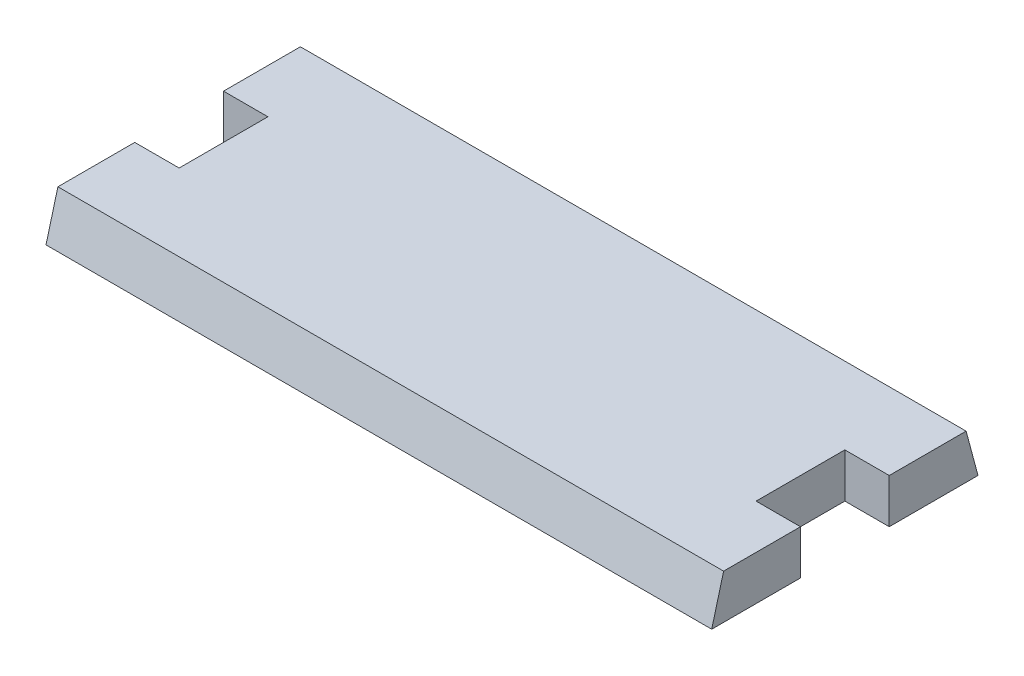
ISO-10303-21;
HEADER;
FILE_DESCRIPTION(('STEP AP214'),'2;1');
FILE_NAME('part.step','',(''),(''),'','','');
FILE_SCHEMA(('AUTOMOTIVE_DESIGN { 1 0 10303 214 1 1 1 1 }'));
ENDSEC;
DATA;
#1=APPLICATION_CONTEXT('core data for automotive mechanical design processes');
#2=APPLICATION_PROTOCOL_DEFINITION('international standard','automotive_design',2000,#1);
#3=PRODUCT_CONTEXT('',#1,'mechanical');
#4=PRODUCT('Part','Part','',(#3));
#5=PRODUCT_RELATED_PRODUCT_CATEGORY('part','',(#4));
#6=PRODUCT_DEFINITION_FORMATION('','',#4);
#7=PRODUCT_DEFINITION_CONTEXT('part definition',#1,'design');
#8=PRODUCT_DEFINITION('design','',#6,#7);
#9=PRODUCT_DEFINITION_SHAPE('','',#8);
#10=(LENGTH_UNIT() NAMED_UNIT(*) SI_UNIT(.MILLI.,.METRE.));
#11=(NAMED_UNIT(*) PLANE_ANGLE_UNIT() SI_UNIT($,.RADIAN.));
#12=(NAMED_UNIT(*) SI_UNIT($,.STERADIAN.) SOLID_ANGLE_UNIT());
#13=UNCERTAINTY_MEASURE_WITH_UNIT(LENGTH_MEASURE(1.E-05),#10,'distance_accuracy_value','');
#14=(GEOMETRIC_REPRESENTATION_CONTEXT(3) GLOBAL_UNCERTAINTY_ASSIGNED_CONTEXT((#13)) GLOBAL_UNIT_ASSIGNED_CONTEXT((#10,
#11,#12)) REPRESENTATION_CONTEXT('',''));
#15=CARTESIAN_POINT('',(0.,0.,0.));
#16=DIRECTION('',(0.,0.,1.));
#17=DIRECTION('',(1.,0.,0.));
#18=AXIS2_PLACEMENT_3D('',#15,#16,#17);
#19=CARTESIAN_POINT('',(0.,0.,-30.));
#20=DIRECTION('',(0.,0.258819045102521,-0.965925826289068));
#21=DIRECTION('',(0.,0.965925826289068,0.258819045102521));
#22=AXIS2_PLACEMENT_3D('',#19,#20,#21);
#23=PLANE('',#22);
#24=DIRECTION('',(1.,0.,0.));
#25=VECTOR('',#24,1.);
#26=CARTESIAN_POINT('',(0.,0.,-30.));
#27=LINE('',#26,#25);
#28=CARTESIAN_POINT('',(-75.,0.,-30.));
#29=VERTEX_POINT('',#28);
#30=CARTESIAN_POINT('',(75.,0.,-30.));
#31=VERTEX_POINT('',#30);
#32=EDGE_CURVE('E133',#29,#31,#27,.T.);
#33=ORIENTED_EDGE('',*,*,#32,.F.);
#34=DIRECTION('',(0.,-0.965925826289068,-0.258819045102521));
#35=VECTOR('',#34,1.);
#36=CARTESIAN_POINT('',(-75.,16.8301270189222,-25.4903810567666));
#37=LINE('',#36,#35);
#38=CARTESIAN_POINT('',(-75.,10.,-27.3205080756888));
#39=VERTEX_POINT('',#38);
#40=EDGE_CURVE('E11',#39,#29,#37,.T.);
#41=ORIENTED_EDGE('',*,*,#40,.F.);
#42=DIRECTION('',(1.,0.,0.));
#43=VECTOR('',#42,1.);
#44=CARTESIAN_POINT('',(0.,10.,-27.3205080756888));
#45=LINE('',#44,#43);
#46=CARTESIAN_POINT('',(75.,10.,-27.3205080756888));
#47=VERTEX_POINT('',#46);
#48=EDGE_CURVE('E135',#39,#47,#45,.T.);
#49=ORIENTED_EDGE('',*,*,#48,.T.);
#50=DIRECTION('',(0.,-0.965925826289068,-0.258819045102521));
#51=VECTOR('',#50,1.);
#52=CARTESIAN_POINT('',(75.,16.8301270189222,-25.4903810567666));
#53=LINE('',#52,#51);
#54=EDGE_CURVE('E131',#47,#31,#53,.T.);
#55=ORIENTED_EDGE('',*,*,#54,.T.);
#56=EDGE_LOOP('',(#33,#41,#49,#55));
#57=FACE_BOUND('',#56,.T.);
#58=ADVANCED_FACE('F32',(#57),#23,.T.);
#59=CARTESIAN_POINT('',(-75.,10.,0.));
#60=DIRECTION('',(-1.,0.,0.));
#61=DIRECTION('',(0.,0.,1.));
#62=AXIS2_PLACEMENT_3D('',#59,#60,#61);
#63=PLANE('',#62);
#64=DIRECTION('',(0.,0.,-1.));
#65=VECTOR('',#64,1.);
#66=CARTESIAN_POINT('',(-75.,0.,0.));
#67=LINE('',#66,#65);
#68=CARTESIAN_POINT('',(-75.,0.,-10.));
#69=VERTEX_POINT('',#68);
#70=EDGE_CURVE('E147',#69,#29,#67,.T.);
#71=ORIENTED_EDGE('',*,*,#70,.F.);
#72=DIRECTION('',(0.,-1.,0.));
#73=VECTOR('',#72,1.);
#74=CARTESIAN_POINT('',(-75.,10.,-10.));
#75=LINE('',#74,#73);
#76=CARTESIAN_POINT('',(-75.,10.,-10.));
#77=VERTEX_POINT('',#76);
#78=EDGE_CURVE('E42',#77,#69,#75,.T.);
#79=ORIENTED_EDGE('',*,*,#78,.F.);
#80=DIRECTION('',(0.,0.,-1.));
#81=VECTOR('',#80,1.);
#82=CARTESIAN_POINT('',(-75.,10.,0.));
#83=LINE('',#82,#81);
#84=EDGE_CURVE('E190',#77,#39,#83,.T.);
#85=ORIENTED_EDGE('',*,*,#84,.T.);
#86=ORIENTED_EDGE('',*,*,#40,.T.);
#87=EDGE_LOOP('',(#71,#79,#85,#86));
#88=FACE_BOUND('',#87,.T.);
#89=ADVANCED_FACE('F248',(#88),#63,.T.);
#90=CARTESIAN_POINT('',(0.,10.,-9.99999999999998));
#91=DIRECTION('',(0.,0.,-1.));
#92=DIRECTION('',(-1.,0.,0.));
#93=AXIS2_PLACEMENT_3D('',#90,#91,#92);
#94=PLANE('',#93);
#95=DIRECTION('',(1.,0.,0.));
#96=VECTOR('',#95,1.);
#97=CARTESIAN_POINT('',(0.,0.,-9.99999999999998));
#98=LINE('',#97,#96);
#99=CARTESIAN_POINT('',(-65.,0.,-10.));
#100=VERTEX_POINT('',#99);
#101=EDGE_CURVE('E149',#69,#100,#98,.T.);
#102=ORIENTED_EDGE('',*,*,#101,.T.);
#103=DIRECTION('',(0.,-1.,0.));
#104=VECTOR('',#103,1.);
#105=CARTESIAN_POINT('',(-65.,10.,-10.));
#106=LINE('',#105,#104);
#107=CARTESIAN_POINT('',(-65.,10.,-10.));
#108=VERTEX_POINT('',#107);
#109=EDGE_CURVE('E186',#108,#100,#106,.T.);
#110=ORIENTED_EDGE('',*,*,#109,.F.);
#111=DIRECTION('',(1.,0.,0.));
#112=VECTOR('',#111,1.);
#113=CARTESIAN_POINT('',(0.,10.,-9.99999999999998));
#114=LINE('',#113,#112);
#115=EDGE_CURVE('E242',#77,#108,#114,.T.);
#116=ORIENTED_EDGE('',*,*,#115,.F.);
#117=ORIENTED_EDGE('',*,*,#78,.T.);
#118=EDGE_LOOP('',(#102,#110,#116,#117));
#119=FACE_BOUND('',#118,.T.);
#120=ADVANCED_FACE('F240',(#119),#94,.F.);
#121=CARTESIAN_POINT('',(-65.,10.,0.));
#122=DIRECTION('',(1.,0.,0.));
#123=DIRECTION('',(0.,0.,-1.));
#124=AXIS2_PLACEMENT_3D('',#121,#122,#123);
#125=PLANE('',#124);
#126=DIRECTION('',(0.,0.,1.));
#127=VECTOR('',#126,1.);
#128=CARTESIAN_POINT('',(-65.,0.,0.));
#129=LINE('',#128,#127);
#130=CARTESIAN_POINT('',(-65.,0.,9.99999999999999));
#131=VERTEX_POINT('',#130);
#132=EDGE_CURVE('E155',#100,#131,#129,.T.);
#133=ORIENTED_EDGE('',*,*,#132,.T.);
#134=DIRECTION('',(0.,-1.,0.));
#135=VECTOR('',#134,1.);
#136=CARTESIAN_POINT('',(-65.,10.,9.99999999999999));
#137=LINE('',#136,#135);
#138=CARTESIAN_POINT('',(-65.,10.,9.99999999999999));
#139=VERTEX_POINT('',#138);
#140=EDGE_CURVE('E184',#139,#131,#137,.T.);
#141=ORIENTED_EDGE('',*,*,#140,.F.);
#142=DIRECTION('',(0.,0.,1.));
#143=VECTOR('',#142,1.);
#144=CARTESIAN_POINT('',(-65.,10.,0.));
#145=LINE('',#144,#143);
#146=EDGE_CURVE('E201',#108,#139,#145,.T.);
#147=ORIENTED_EDGE('',*,*,#146,.F.);
#148=ORIENTED_EDGE('',*,*,#109,.T.);
#149=EDGE_LOOP('',(#133,#141,#147,#148));
#150=FACE_BOUND('',#149,.T.);
#151=ADVANCED_FACE('F235',(#150),#125,.F.);
#152=CARTESIAN_POINT('',(0.,10.,9.99999999999998));
#153=DIRECTION('',(0.,0.,-1.));
#154=DIRECTION('',(-1.,0.,0.));
#155=AXIS2_PLACEMENT_3D('',#152,#153,#154);
#156=PLANE('',#155);
#157=DIRECTION('',(1.,0.,0.));
#158=VECTOR('',#157,1.);
#159=CARTESIAN_POINT('',(0.,0.,9.99999999999998));
#160=LINE('',#159,#158);
#161=CARTESIAN_POINT('',(-75.,0.,9.99999999999999));
#162=VERTEX_POINT('',#161);
#163=EDGE_CURVE('E158',#162,#131,#160,.T.);
#164=ORIENTED_EDGE('',*,*,#163,.F.);
#165=DIRECTION('',(0.,-1.,0.));
#166=VECTOR('',#165,1.);
#167=CARTESIAN_POINT('',(-75.,10.,9.99999999999999));
#168=LINE('',#167,#166);
#169=CARTESIAN_POINT('',(-75.,10.,9.99999999999999));
#170=VERTEX_POINT('',#169);
#171=EDGE_CURVE('E81',#170,#162,#168,.T.);
#172=ORIENTED_EDGE('',*,*,#171,.F.);
#173=DIRECTION('',(1.,0.,0.));
#174=VECTOR('',#173,1.);
#175=CARTESIAN_POINT('',(0.,10.,9.99999999999998));
#176=LINE('',#175,#174);
#177=EDGE_CURVE('E199',#170,#139,#176,.T.);
#178=ORIENTED_EDGE('',*,*,#177,.T.);
#179=ORIENTED_EDGE('',*,*,#140,.T.);
#180=EDGE_LOOP('',(#164,#172,#178,#179));
#181=FACE_BOUND('',#180,.T.);
#182=ADVANCED_FACE('F231',(#181),#156,.T.);
#183=CARTESIAN_POINT('',(-75.,10.,0.));
#184=DIRECTION('',(-1.,0.,0.));
#185=DIRECTION('',(0.,0.,1.));
#186=AXIS2_PLACEMENT_3D('',#183,#184,#185);
#187=PLANE('',#186);
#188=DIRECTION('',(0.,0.,-1.));
#189=VECTOR('',#188,1.);
#190=CARTESIAN_POINT('',(-75.,0.,0.));
#191=LINE('',#190,#189);
#192=CARTESIAN_POINT('',(-75.,0.,30.));
#193=VERTEX_POINT('',#192);
#194=EDGE_CURVE('E161',#193,#162,#191,.T.);
#195=ORIENTED_EDGE('',*,*,#194,.F.);
#196=DIRECTION('',(0.,0.965925826289068,-0.258819045102521));
#197=VECTOR('',#196,1.);
#198=CARTESIAN_POINT('',(-75.,16.8301270189222,25.4903810567666));
#199=LINE('',#198,#197);
#200=CARTESIAN_POINT('',(-75.,10.,27.3205080756888));
#201=VERTEX_POINT('',#200);
#202=EDGE_CURVE('E70',#201,#193,#199,.F.);
#203=ORIENTED_EDGE('',*,*,#202,.F.);
#204=DIRECTION('',(0.,0.,-1.));
#205=VECTOR('',#204,1.);
#206=CARTESIAN_POINT('',(-75.,10.,0.));
#207=LINE('',#206,#205);
#208=EDGE_CURVE('E194',#201,#170,#207,.T.);
#209=ORIENTED_EDGE('',*,*,#208,.T.);
#210=ORIENTED_EDGE('',*,*,#171,.T.);
#211=EDGE_LOOP('',(#195,#203,#209,#210));
#212=FACE_BOUND('',#211,.T.);
#213=ADVANCED_FACE('F230',(#212),#187,.T.);
#214=CARTESIAN_POINT('',(0.,0.,30.));
#215=DIRECTION('',(0.,0.258819045102521,0.965925826289068));
#216=DIRECTION('',(0.,-0.965925826289068,0.258819045102521));
#217=AXIS2_PLACEMENT_3D('',#214,#215,#216);
#218=PLANE('',#217);
#219=DIRECTION('',(1.,0.,0.));
#220=VECTOR('',#219,1.);
#221=CARTESIAN_POINT('',(0.,0.,30.));
#222=LINE('',#221,#220);
#223=CARTESIAN_POINT('',(75.,0.,30.));
#224=VERTEX_POINT('',#223);
#225=EDGE_CURVE('E164',#193,#224,#222,.T.);
#226=ORIENTED_EDGE('',*,*,#225,.T.);
#227=DIRECTION('',(0.,0.965925826289068,-0.258819045102521));
#228=VECTOR('',#227,1.);
#229=CARTESIAN_POINT('',(75.,16.8301270189222,25.4903810567666));
#230=LINE('',#229,#228);
#231=CARTESIAN_POINT('',(75.,10.,27.3205080756888));
#232=VERTEX_POINT('',#231);
#233=EDGE_CURVE('E36',#232,#224,#230,.F.);
#234=ORIENTED_EDGE('',*,*,#233,.F.);
#235=DIRECTION('',(-1.,0.,0.));
#236=VECTOR('',#235,1.);
#237=CARTESIAN_POINT('',(0.,10.,27.3205080756888));
#238=LINE('',#237,#236);
#239=EDGE_CURVE('E192',#201,#232,#238,.F.);
#240=ORIENTED_EDGE('',*,*,#239,.F.);
#241=ORIENTED_EDGE('',*,*,#202,.T.);
#242=EDGE_LOOP('',(#226,#234,#240,#241));
#243=FACE_BOUND('',#242,.T.);
#244=ADVANCED_FACE('F34',(#243),#218,.T.);
#245=CARTESIAN_POINT('',(75.,10.,0.));
#246=DIRECTION('',(-1.,0.,0.));
#247=DIRECTION('',(0.,0.,1.));
#248=AXIS2_PLACEMENT_3D('',#245,#246,#247);
#249=PLANE('',#248);
#250=DIRECTION('',(0.,0.,-1.));
#251=VECTOR('',#250,1.);
#252=CARTESIAN_POINT('',(75.,0.,0.));
#253=LINE('',#252,#251);
#254=CARTESIAN_POINT('',(75.,0.,9.99999999999999));
#255=VERTEX_POINT('',#254);
#256=EDGE_CURVE('E166',#224,#255,#253,.T.);
#257=ORIENTED_EDGE('',*,*,#256,.T.);
#258=DIRECTION('',(0.,-1.,0.));
#259=VECTOR('',#258,1.);
#260=CARTESIAN_POINT('',(75.,10.,9.99999999999999));
#261=LINE('',#260,#259);
#262=CARTESIAN_POINT('',(75.,10.,9.99999999999999));
#263=VERTEX_POINT('',#262);
#264=EDGE_CURVE('E180',#263,#255,#261,.T.);
#265=ORIENTED_EDGE('',*,*,#264,.F.);
#266=DIRECTION('',(0.,0.,-1.));
#267=VECTOR('',#266,1.);
#268=CARTESIAN_POINT('',(75.,10.,0.));
#269=LINE('',#268,#267);
#270=EDGE_CURVE('E193',#232,#263,#269,.T.);
#271=ORIENTED_EDGE('',*,*,#270,.F.);
#272=ORIENTED_EDGE('',*,*,#233,.T.);
#273=EDGE_LOOP('',(#257,#265,#271,#272));
#274=FACE_BOUND('',#273,.T.);
#275=ADVANCED_FACE('F227',(#274),#249,.F.);
#276=CARTESIAN_POINT('',(0.,10.,9.99999999999998));
#277=DIRECTION('',(0.,0.,1.));
#278=DIRECTION('',(1.,0.,0.));
#279=AXIS2_PLACEMENT_3D('',#276,#277,#278);
#280=PLANE('',#279);
#281=DIRECTION('',(-1.,0.,0.));
#282=VECTOR('',#281,1.);
#283=CARTESIAN_POINT('',(0.,0.,9.99999999999998));
#284=LINE('',#283,#282);
#285=CARTESIAN_POINT('',(65.,0.,9.99999999999999));
#286=VERTEX_POINT('',#285);
#287=EDGE_CURVE('E168',#255,#286,#284,.T.);
#288=ORIENTED_EDGE('',*,*,#287,.T.);
#289=DIRECTION('',(0.,-1.,0.));
#290=VECTOR('',#289,1.);
#291=CARTESIAN_POINT('',(65.,10.,9.99999999999999));
#292=LINE('',#291,#290);
#293=CARTESIAN_POINT('',(65.,10.,9.99999999999999));
#294=VERTEX_POINT('',#293);
#295=EDGE_CURVE('E178',#294,#286,#292,.T.);
#296=ORIENTED_EDGE('',*,*,#295,.F.);
#297=DIRECTION('',(-1.,0.,0.));
#298=VECTOR('',#297,1.);
#299=CARTESIAN_POINT('',(0.,10.,9.99999999999998));
#300=LINE('',#299,#298);
#301=EDGE_CURVE('E197',#263,#294,#300,.T.);
#302=ORIENTED_EDGE('',*,*,#301,.F.);
#303=ORIENTED_EDGE('',*,*,#264,.T.);
#304=EDGE_LOOP('',(#288,#296,#302,#303));
#305=FACE_BOUND('',#304,.T.);
#306=ADVANCED_FACE('F223',(#305),#280,.F.);
#307=CARTESIAN_POINT('',(65.,10.,0.));
#308=DIRECTION('',(1.,0.,0.));
#309=DIRECTION('',(0.,0.,-1.));
#310=AXIS2_PLACEMENT_3D('',#307,#308,#309);
#311=PLANE('',#310);
#312=DIRECTION('',(0.,0.,1.));
#313=VECTOR('',#312,1.);
#314=CARTESIAN_POINT('',(65.,0.,0.));
#315=LINE('',#314,#313);
#316=CARTESIAN_POINT('',(65.,0.,-10.));
#317=VERTEX_POINT('',#316);
#318=EDGE_CURVE('E171',#317,#286,#315,.T.);
#319=ORIENTED_EDGE('',*,*,#318,.F.);
#320=DIRECTION('',(0.,-1.,0.));
#321=VECTOR('',#320,1.);
#322=CARTESIAN_POINT('',(65.,10.,-10.));
#323=LINE('',#322,#321);
#324=CARTESIAN_POINT('',(65.,10.,-10.));
#325=VERTEX_POINT('',#324);
#326=EDGE_CURVE('E176',#325,#317,#323,.T.);
#327=ORIENTED_EDGE('',*,*,#326,.F.);
#328=DIRECTION('',(0.,0.,1.));
#329=VECTOR('',#328,1.);
#330=CARTESIAN_POINT('',(65.,10.,0.));
#331=LINE('',#330,#329);
#332=EDGE_CURVE('E206',#325,#294,#331,.T.);
#333=ORIENTED_EDGE('',*,*,#332,.T.);
#334=ORIENTED_EDGE('',*,*,#295,.T.);
#335=EDGE_LOOP('',(#319,#327,#333,#334));
#336=FACE_BOUND('',#335,.T.);
#337=ADVANCED_FACE('F218',(#336),#311,.T.);
#338=CARTESIAN_POINT('',(0.,10.,-9.99999999999998));
#339=DIRECTION('',(0.,0.,1.));
#340=DIRECTION('',(1.,0.,0.));
#341=AXIS2_PLACEMENT_3D('',#338,#339,#340);
#342=PLANE('',#341);
#343=DIRECTION('',(-1.,0.,0.));
#344=VECTOR('',#343,1.);
#345=CARTESIAN_POINT('',(0.,0.,-9.99999999999998));
#346=LINE('',#345,#344);
#347=CARTESIAN_POINT('',(75.,0.,-10.));
#348=VERTEX_POINT('',#347);
#349=EDGE_CURVE('E142',#348,#317,#346,.T.);
#350=ORIENTED_EDGE('',*,*,#349,.F.);
#351=DIRECTION('',(0.,-1.,0.));
#352=VECTOR('',#351,1.);
#353=CARTESIAN_POINT('',(75.,10.,-10.));
#354=LINE('',#353,#352);
#355=CARTESIAN_POINT('',(75.,10.,-10.));
#356=VERTEX_POINT('',#355);
#357=EDGE_CURVE('E125',#356,#348,#354,.T.);
#358=ORIENTED_EDGE('',*,*,#357,.F.);
#359=DIRECTION('',(-1.,0.,0.));
#360=VECTOR('',#359,1.);
#361=CARTESIAN_POINT('',(0.,10.,-9.99999999999998));
#362=LINE('',#361,#360);
#363=EDGE_CURVE('E208',#356,#325,#362,.T.);
#364=ORIENTED_EDGE('',*,*,#363,.T.);
#365=ORIENTED_EDGE('',*,*,#326,.T.);
#366=EDGE_LOOP('',(#350,#358,#364,#365));
#367=FACE_BOUND('',#366,.T.);
#368=ADVANCED_FACE('F211',(#367),#342,.T.);
#369=CARTESIAN_POINT('',(75.,10.,0.));
#370=DIRECTION('',(-1.,0.,0.));
#371=DIRECTION('',(0.,0.,1.));
#372=AXIS2_PLACEMENT_3D('',#369,#370,#371);
#373=PLANE('',#372);
#374=DIRECTION('',(0.,0.,-1.));
#375=VECTOR('',#374,1.);
#376=CARTESIAN_POINT('',(75.,0.,0.));
#377=LINE('',#376,#375);
#378=EDGE_CURVE('E137',#348,#31,#377,.T.);
#379=ORIENTED_EDGE('',*,*,#378,.T.);
#380=ORIENTED_EDGE('',*,*,#54,.F.);
#381=DIRECTION('',(0.,0.,-1.));
#382=VECTOR('',#381,1.);
#383=CARTESIAN_POINT('',(75.,10.,0.));
#384=LINE('',#383,#382);
#385=EDGE_CURVE('E51',#356,#47,#384,.T.);
#386=ORIENTED_EDGE('',*,*,#385,.F.);
#387=ORIENTED_EDGE('',*,*,#357,.T.);
#388=EDGE_LOOP('',(#379,#380,#386,#387));
#389=FACE_BOUND('',#388,.T.);
#390=ADVANCED_FACE('F138',(#389),#373,.F.);
#391=CARTESIAN_POINT('',(0.,10.,0.));
#392=DIRECTION('',(0.,1.,0.));
#393=DIRECTION('',(0.,0.,1.));
#394=AXIS2_PLACEMENT_3D('',#391,#392,#393);
#395=PLANE('',#394);
#396=ORIENTED_EDGE('',*,*,#48,.F.);
#397=ORIENTED_EDGE('',*,*,#84,.F.);
#398=ORIENTED_EDGE('',*,*,#115,.T.);
#399=ORIENTED_EDGE('',*,*,#146,.T.);
#400=ORIENTED_EDGE('',*,*,#177,.F.);
#401=ORIENTED_EDGE('',*,*,#208,.F.);
#402=ORIENTED_EDGE('',*,*,#239,.T.);
#403=ORIENTED_EDGE('',*,*,#270,.T.);
#404=ORIENTED_EDGE('',*,*,#301,.T.);
#405=ORIENTED_EDGE('',*,*,#332,.F.);
#406=ORIENTED_EDGE('',*,*,#363,.F.);
#407=ORIENTED_EDGE('',*,*,#385,.T.);
#408=EDGE_LOOP('',(#396,#397,#398,#399,#400,#401,#402,#403,#404,#405,#406,#407));
#409=FACE_BOUND('',#408,.T.);
#410=ADVANCED_FACE('F214',(#409),#395,.T.);
#411=CARTESIAN_POINT('',(0.,0.,0.));
#412=DIRECTION('',(0.,1.,0.));
#413=DIRECTION('',(0.,0.,1.));
#414=AXIS2_PLACEMENT_3D('',#411,#412,#413);
#415=PLANE('',#414);
#416=ORIENTED_EDGE('',*,*,#32,.T.);
#417=ORIENTED_EDGE('',*,*,#378,.F.);
#418=ORIENTED_EDGE('',*,*,#349,.T.);
#419=ORIENTED_EDGE('',*,*,#318,.T.);
#420=ORIENTED_EDGE('',*,*,#287,.F.);
#421=ORIENTED_EDGE('',*,*,#256,.F.);
#422=ORIENTED_EDGE('',*,*,#225,.F.);
#423=ORIENTED_EDGE('',*,*,#194,.T.);
#424=ORIENTED_EDGE('',*,*,#163,.T.);
#425=ORIENTED_EDGE('',*,*,#132,.F.);
#426=ORIENTED_EDGE('',*,*,#101,.F.);
#427=ORIENTED_EDGE('',*,*,#70,.T.);
#428=EDGE_LOOP('',(#416,#417,#418,#419,#420,#421,#422,#423,#424,#425,#426,#427));
#429=FACE_BOUND('',#428,.T.);
#430=ADVANCED_FACE('F144',(#429),#415,.F.);
#431=CLOSED_SHELL('',(#58,#89,#120,#151,#182,#213,#244,#275,#306,#337,#368,#390,#410,#430));
#432=MANIFOLD_SOLID_BREP('B2',#431);
#433=ADVANCED_BREP_SHAPE_REPRESENTATION('',(#18,#432),#14);
#434=SHAPE_DEFINITION_REPRESENTATION(#9,#433);
ENDSEC;
END-ISO-10303-21;
